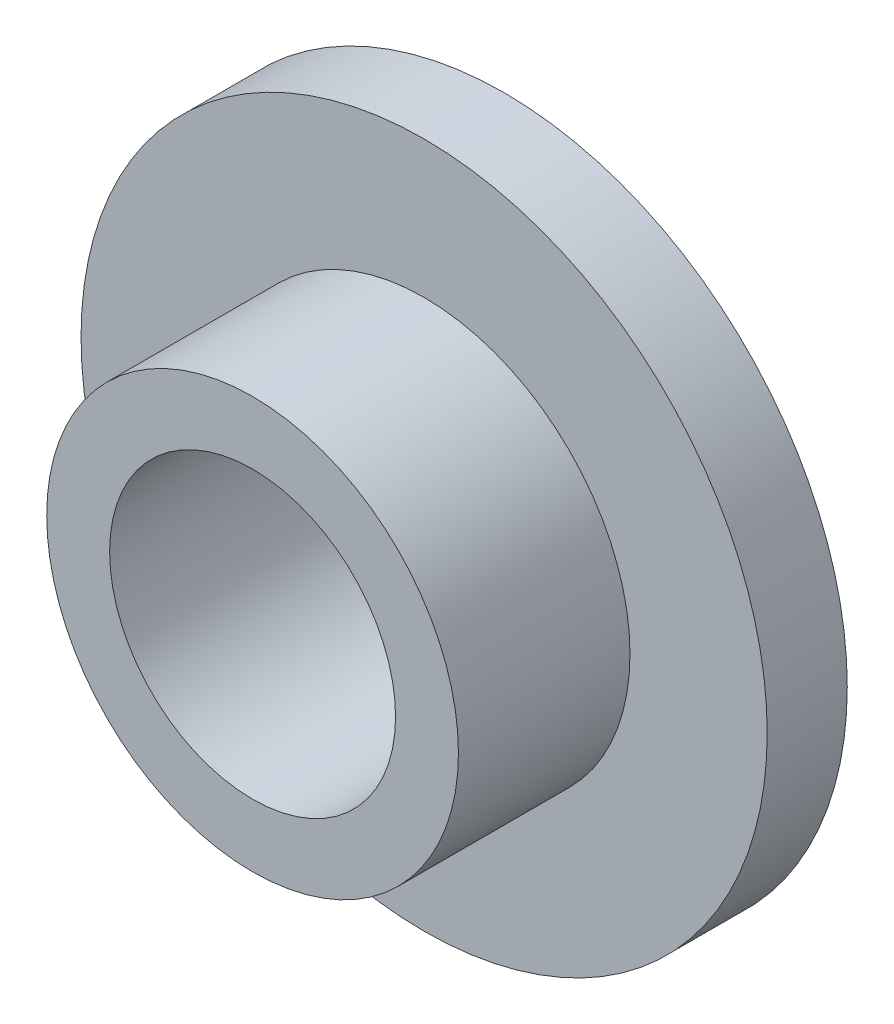
ISO-10303-21;
HEADER;
FILE_DESCRIPTION(('STEP AP214'),'2;1');
FILE_NAME('part.step','',(''),(''),'','','');
FILE_SCHEMA(('AUTOMOTIVE_DESIGN { 1 0 10303 214 1 1 1 1 }'));
ENDSEC;
DATA;
#1=APPLICATION_CONTEXT('core data for automotive mechanical design processes');
#2=APPLICATION_PROTOCOL_DEFINITION('international standard','automotive_design',2000,#1);
#3=PRODUCT_CONTEXT('',#1,'mechanical');
#4=PRODUCT('Part','Part','',(#3));
#5=PRODUCT_RELATED_PRODUCT_CATEGORY('part','',(#4));
#6=PRODUCT_DEFINITION_FORMATION('','',#4);
#7=PRODUCT_DEFINITION_CONTEXT('part definition',#1,'design');
#8=PRODUCT_DEFINITION('design','',#6,#7);
#9=PRODUCT_DEFINITION_SHAPE('','',#8);
#10=(LENGTH_UNIT() NAMED_UNIT(*) SI_UNIT(.MILLI.,.METRE.));
#11=(NAMED_UNIT(*) PLANE_ANGLE_UNIT() SI_UNIT($,.RADIAN.));
#12=(NAMED_UNIT(*) SI_UNIT($,.STERADIAN.) SOLID_ANGLE_UNIT());
#13=UNCERTAINTY_MEASURE_WITH_UNIT(LENGTH_MEASURE(1.E-05),#10,'distance_accuracy_value','');
#14=(GEOMETRIC_REPRESENTATION_CONTEXT(3) GLOBAL_UNCERTAINTY_ASSIGNED_CONTEXT((#13)) GLOBAL_UNIT_ASSIGNED_CONTEXT((#10,
#11,#12)) REPRESENTATION_CONTEXT('',''));
#15=CARTESIAN_POINT('',(0.,0.,0.));
#16=DIRECTION('',(0.,0.,1.));
#17=DIRECTION('',(1.,0.,0.));
#18=AXIS2_PLACEMENT_3D('',#15,#16,#17);
#19=CARTESIAN_POINT('',(0.,0.,7.));
#20=DIRECTION('',(0.,0.,1.));
#21=DIRECTION('',(1.,0.,0.));
#22=AXIS2_PLACEMENT_3D('',#19,#20,#21);
#23=PLANE('',#22);
#24=CARTESIAN_POINT('',(0.,0.,7.));
#25=DIRECTION('',(0.,0.,1.));
#26=DIRECTION('',(1.,0.,0.));
#27=AXIS2_PLACEMENT_3D('',#24,#25,#26);
#28=CIRCLE('',#27,30.);
#29=CARTESIAN_POINT('',(30.,0.,7.));
#30=VERTEX_POINT('',#29);
#31=EDGE_CURVE('E10',#30,#30,#28,.T.);
#32=ORIENTED_EDGE('',*,*,#31,.T.);
#33=EDGE_LOOP('',(#32));
#34=FACE_BOUND('',#33,.T.);
#35=CARTESIAN_POINT('',(0.,0.,7.));
#36=DIRECTION('',(0.,0.,1.));
#37=DIRECTION('',(1.,0.,0.));
#38=AXIS2_PLACEMENT_3D('',#35,#36,#37);
#39=CIRCLE('',#38,18.);
#40=CARTESIAN_POINT('',(18.,0.,7.));
#41=VERTEX_POINT('',#40);
#42=EDGE_CURVE('E45',#41,#41,#39,.T.);
#43=ORIENTED_EDGE('',*,*,#42,.F.);
#44=EDGE_LOOP('',(#43));
#45=FACE_BOUND('',#44,.T.);
#46=ADVANCED_FACE('F29',(#34,#45),#23,.T.);
#47=CARTESIAN_POINT('',(0.,0.,0.));
#48=DIRECTION('',(0.,0.,1.));
#49=DIRECTION('',(1.,0.,0.));
#50=AXIS2_PLACEMENT_3D('',#47,#48,#49);
#51=PLANE('',#50);
#52=CARTESIAN_POINT('',(0.,0.,0.));
#53=DIRECTION('',(0.,0.,1.));
#54=DIRECTION('',(1.,0.,0.));
#55=AXIS2_PLACEMENT_3D('',#52,#53,#54);
#56=CIRCLE('',#55,30.);
#57=CARTESIAN_POINT('',(30.,0.,0.));
#58=VERTEX_POINT('',#57);
#59=EDGE_CURVE('E33',#58,#58,#56,.T.);
#60=ORIENTED_EDGE('',*,*,#59,.F.);
#61=EDGE_LOOP('',(#60));
#62=FACE_BOUND('',#61,.T.);
#63=CARTESIAN_POINT('',(0.,0.,0.));
#64=DIRECTION('',(0.,0.,1.));
#65=DIRECTION('',(1.,0.,0.));
#66=AXIS2_PLACEMENT_3D('',#63,#64,#65);
#67=CIRCLE('',#66,12.5);
#68=CARTESIAN_POINT('',(12.5,0.,0.));
#69=VERTEX_POINT('',#68);
#70=EDGE_CURVE('E40',#69,#69,#67,.T.);
#71=ORIENTED_EDGE('',*,*,#70,.T.);
#72=EDGE_LOOP('',(#71));
#73=FACE_BOUND('',#72,.T.);
#74=ADVANCED_FACE('F70',(#62,#73),#51,.F.);
#75=CARTESIAN_POINT('',(0.,0.,7.));
#76=DIRECTION('',(0.,0.,-1.));
#77=DIRECTION('',(-1.,0.,0.));
#78=AXIS2_PLACEMENT_3D('',#75,#76,#77);
#79=CYLINDRICAL_SURFACE('',#78,30.);
#80=ORIENTED_EDGE('',*,*,#31,.F.);
#81=EDGE_LOOP('',(#80));
#82=FACE_BOUND('',#81,.T.);
#83=ORIENTED_EDGE('',*,*,#59,.T.);
#84=EDGE_LOOP('',(#83));
#85=FACE_BOUND('',#84,.T.);
#86=ADVANCED_FACE('F31',(#82,#85),#79,.T.);
#87=CARTESIAN_POINT('',(0.,0.,7.));
#88=DIRECTION('',(0.,0.,-1.));
#89=DIRECTION('',(-1.,0.,0.));
#90=AXIS2_PLACEMENT_3D('',#87,#88,#89);
#91=CYLINDRICAL_SURFACE('',#90,12.5);
#92=ORIENTED_EDGE('',*,*,#70,.F.);
#93=EDGE_LOOP('',(#92));
#94=FACE_BOUND('',#93,.T.);
#95=CARTESIAN_POINT('',(0.,0.,22.));
#96=DIRECTION('',(0.,0.,1.));
#97=DIRECTION('',(1.,0.,0.));
#98=AXIS2_PLACEMENT_3D('',#95,#96,#97);
#99=CIRCLE('',#98,12.5);
#100=CARTESIAN_POINT('',(12.5,0.,22.));
#101=VERTEX_POINT('',#100);
#102=EDGE_CURVE('E48',#101,#101,#99,.T.);
#103=ORIENTED_EDGE('',*,*,#102,.T.);
#104=EDGE_LOOP('',(#103));
#105=FACE_BOUND('',#104,.T.);
#106=ADVANCED_FACE('F54',(#94,#105),#91,.F.);
#107=CARTESIAN_POINT('',(0.,0.,22.));
#108=DIRECTION('',(0.,0.,1.));
#109=DIRECTION('',(1.,0.,0.));
#110=AXIS2_PLACEMENT_3D('',#107,#108,#109);
#111=PLANE('',#110);
#112=CARTESIAN_POINT('',(0.,0.,22.));
#113=DIRECTION('',(0.,0.,1.));
#114=DIRECTION('',(1.,0.,0.));
#115=AXIS2_PLACEMENT_3D('',#112,#113,#114);
#116=CIRCLE('',#115,18.);
#117=CARTESIAN_POINT('',(18.,0.,22.));
#118=VERTEX_POINT('',#117);
#119=EDGE_CURVE('E44',#118,#118,#116,.T.);
#120=ORIENTED_EDGE('',*,*,#119,.T.);
#121=EDGE_LOOP('',(#120));
#122=FACE_BOUND('',#121,.T.);
#123=ORIENTED_EDGE('',*,*,#102,.F.);
#124=EDGE_LOOP('',(#123));
#125=FACE_BOUND('',#124,.T.);
#126=ADVANCED_FACE('F56',(#122,#125),#111,.T.);
#127=CARTESIAN_POINT('',(0.,0.,22.));
#128=DIRECTION('',(0.,0.,-1.));
#129=DIRECTION('',(-1.,0.,0.));
#130=AXIS2_PLACEMENT_3D('',#127,#128,#129);
#131=CYLINDRICAL_SURFACE('',#130,18.);
#132=ORIENTED_EDGE('',*,*,#119,.F.);
#133=EDGE_LOOP('',(#132));
#134=FACE_BOUND('',#133,.T.);
#135=ORIENTED_EDGE('',*,*,#42,.T.);
#136=EDGE_LOOP('',(#135));
#137=FACE_BOUND('',#136,.T.);
#138=ADVANCED_FACE('F58',(#134,#137),#131,.T.);
#139=CLOSED_SHELL('',(#46,#74,#86,#106,#126,#138));
#140=MANIFOLD_SOLID_BREP('B2',#139);
#141=ADVANCED_BREP_SHAPE_REPRESENTATION('',(#18,#140),#14);
#142=SHAPE_DEFINITION_REPRESENTATION(#9,#141);
ENDSEC;
END-ISO-10303-21;
